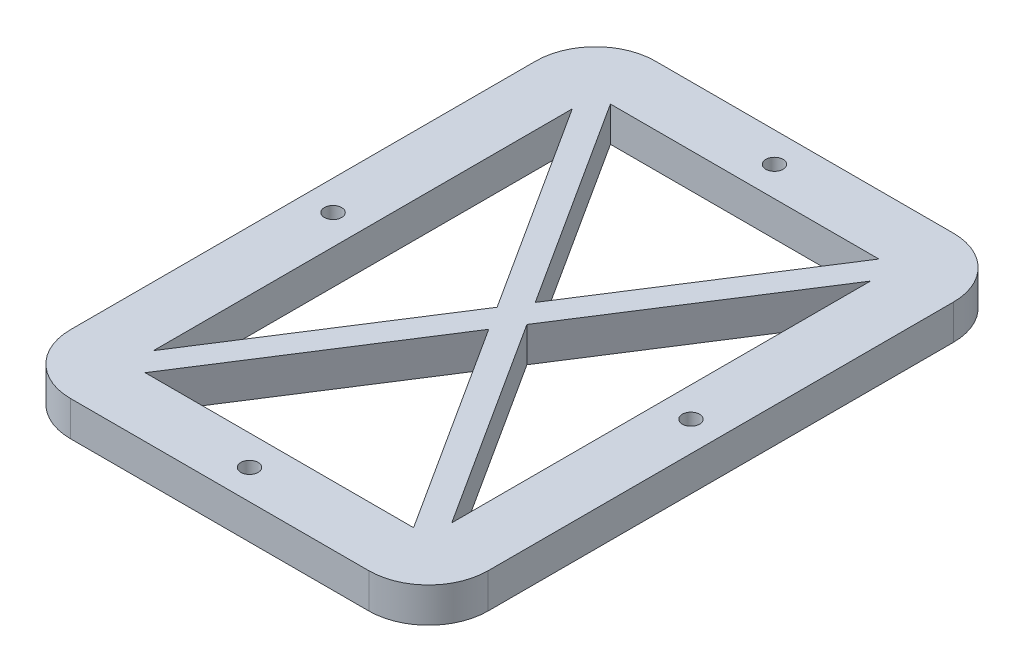
ISO-10303-21;
HEADER;
FILE_DESCRIPTION(('STEP AP214'),'2;1');
FILE_NAME('part.step','',(''),(''),'','','');
FILE_SCHEMA(('AUTOMOTIVE_DESIGN { 1 0 10303 214 1 1 1 1 }'));
ENDSEC;
DATA;
#1=APPLICATION_CONTEXT('core data for automotive mechanical design processes');
#2=APPLICATION_PROTOCOL_DEFINITION('international standard','automotive_design',2000,#1);
#3=PRODUCT_CONTEXT('',#1,'mechanical');
#4=PRODUCT('Part','Part','',(#3));
#5=PRODUCT_RELATED_PRODUCT_CATEGORY('part','',(#4));
#6=PRODUCT_DEFINITION_FORMATION('','',#4);
#7=PRODUCT_DEFINITION_CONTEXT('part definition',#1,'design');
#8=PRODUCT_DEFINITION('design','',#6,#7);
#9=PRODUCT_DEFINITION_SHAPE('','',#8);
#10=(LENGTH_UNIT() NAMED_UNIT(*) SI_UNIT(.MILLI.,.METRE.));
#11=(NAMED_UNIT(*) PLANE_ANGLE_UNIT() SI_UNIT($,.RADIAN.));
#12=(NAMED_UNIT(*) SI_UNIT($,.STERADIAN.) SOLID_ANGLE_UNIT());
#13=UNCERTAINTY_MEASURE_WITH_UNIT(LENGTH_MEASURE(1.E-05),#10,'distance_accuracy_value','');
#14=(GEOMETRIC_REPRESENTATION_CONTEXT(3) GLOBAL_UNCERTAINTY_ASSIGNED_CONTEXT((#13)) GLOBAL_UNIT_ASSIGNED_CONTEXT((#10,
#11,#12)) REPRESENTATION_CONTEXT('',''));
#15=CARTESIAN_POINT('',(0.,0.,0.));
#16=DIRECTION('',(0.,0.,1.));
#17=DIRECTION('',(1.,0.,0.));
#18=AXIS2_PLACEMENT_3D('',#15,#16,#17);
#19=CARTESIAN_POINT('',(-25.,5.85,39.));
#20=DIRECTION('',(0.,-1.,0.));
#21=DIRECTION('',(0.,0.,-1.));
#22=AXIS2_PLACEMENT_3D('',#19,#20,#21);
#23=CYLINDRICAL_SURFACE('',#22,10.);
#24=CARTESIAN_POINT('',(-25.,0.,39.));
#25=DIRECTION('',(0.,1.,0.));
#26=DIRECTION('',(0.,0.,1.));
#27=AXIS2_PLACEMENT_3D('',#24,#25,#26);
#28=CIRCLE('',#27,10.);
#29=CARTESIAN_POINT('',(-25.,0.,49.));
#30=VERTEX_POINT('',#29);
#31=CARTESIAN_POINT('',(-35.,0.,39.));
#32=VERTEX_POINT('',#31);
#33=EDGE_CURVE('E252',#30,#32,#28,.F.);
#34=ORIENTED_EDGE('',*,*,#33,.F.);
#35=DIRECTION('',(0.,-1.,0.));
#36=VECTOR('',#35,1.);
#37=CARTESIAN_POINT('',(-25.,5.85,49.));
#38=LINE('',#37,#36);
#39=CARTESIAN_POINT('',(-25.,5.85,49.));
#40=VERTEX_POINT('',#39);
#41=EDGE_CURVE('E11',#40,#30,#38,.T.);
#42=ORIENTED_EDGE('',*,*,#41,.F.);
#43=CARTESIAN_POINT('',(-25.,5.85,39.));
#44=DIRECTION('',(0.,1.,0.));
#45=DIRECTION('',(0.,0.,1.));
#46=AXIS2_PLACEMENT_3D('',#43,#44,#45);
#47=CIRCLE('',#46,10.);
#48=CARTESIAN_POINT('',(-35.,5.85,39.));
#49=VERTEX_POINT('',#48);
#50=EDGE_CURVE('E359',#40,#49,#47,.F.);
#51=ORIENTED_EDGE('',*,*,#50,.T.);
#52=DIRECTION('',(0.,-1.,0.));
#53=VECTOR('',#52,1.);
#54=CARTESIAN_POINT('',(-35.,5.85,39.));
#55=LINE('',#54,#53);
#56=EDGE_CURVE('E123',#49,#32,#55,.T.);
#57=ORIENTED_EDGE('',*,*,#56,.T.);
#58=EDGE_LOOP('',(#34,#42,#51,#57));
#59=FACE_BOUND('',#58,.T.);
#60=ADVANCED_FACE('F34',(#59),#23,.T.);
#61=CARTESIAN_POINT('',(0.,5.85,49.));
#62=DIRECTION('',(0.,0.,-1.));
#63=DIRECTION('',(-1.,0.,0.));
#64=AXIS2_PLACEMENT_3D('',#61,#62,#63);
#65=PLANE('',#64);
#66=DIRECTION('',(1.,0.,0.));
#67=VECTOR('',#66,1.);
#68=CARTESIAN_POINT('',(0.,0.,49.));
#69=LINE('',#68,#67);
#70=CARTESIAN_POINT('',(25.,0.,49.));
#71=VERTEX_POINT('',#70);
#72=EDGE_CURVE('E255',#30,#71,#69,.T.);
#73=ORIENTED_EDGE('',*,*,#72,.T.);
#74=DIRECTION('',(0.,-1.,0.));
#75=VECTOR('',#74,1.);
#76=CARTESIAN_POINT('',(25.,5.85,49.));
#77=LINE('',#76,#75);
#78=CARTESIAN_POINT('',(25.,5.85,49.));
#79=VERTEX_POINT('',#78);
#80=EDGE_CURVE('E44',#79,#71,#77,.T.);
#81=ORIENTED_EDGE('',*,*,#80,.F.);
#82=DIRECTION('',(1.,0.,0.));
#83=VECTOR('',#82,1.);
#84=CARTESIAN_POINT('',(0.,5.85,49.));
#85=LINE('',#84,#83);
#86=EDGE_CURVE('E361',#40,#79,#85,.T.);
#87=ORIENTED_EDGE('',*,*,#86,.F.);
#88=ORIENTED_EDGE('',*,*,#41,.T.);
#89=EDGE_LOOP('',(#73,#81,#87,#88));
#90=FACE_BOUND('',#89,.T.);
#91=ADVANCED_FACE('F379',(#90),#65,.F.);
#92=CARTESIAN_POINT('',(25.,5.85,39.));
#93=DIRECTION('',(0.,-1.,0.));
#94=DIRECTION('',(0.,0.,-1.));
#95=AXIS2_PLACEMENT_3D('',#92,#93,#94);
#96=CYLINDRICAL_SURFACE('',#95,10.);
#97=CARTESIAN_POINT('',(25.,0.,39.));
#98=DIRECTION('',(0.,1.,0.));
#99=DIRECTION('',(0.,0.,1.));
#100=AXIS2_PLACEMENT_3D('',#97,#98,#99);
#101=CIRCLE('',#100,10.);
#102=CARTESIAN_POINT('',(35.,0.,39.));
#103=VERTEX_POINT('',#102);
#104=EDGE_CURVE('E258',#103,#71,#101,.F.);
#105=ORIENTED_EDGE('',*,*,#104,.F.);
#106=DIRECTION('',(0.,-1.,0.));
#107=VECTOR('',#106,1.);
#108=CARTESIAN_POINT('',(35.,5.85,39.));
#109=LINE('',#108,#107);
#110=CARTESIAN_POINT('',(35.,5.85,39.));
#111=VERTEX_POINT('',#110);
#112=EDGE_CURVE('E279',#111,#103,#109,.T.);
#113=ORIENTED_EDGE('',*,*,#112,.F.);
#114=CARTESIAN_POINT('',(25.,5.85,39.));
#115=DIRECTION('',(0.,1.,0.));
#116=DIRECTION('',(0.,0.,1.));
#117=AXIS2_PLACEMENT_3D('',#114,#115,#116);
#118=CIRCLE('',#117,10.);
#119=EDGE_CURVE('E363',#111,#79,#118,.F.);
#120=ORIENTED_EDGE('',*,*,#119,.T.);
#121=ORIENTED_EDGE('',*,*,#80,.T.);
#122=EDGE_LOOP('',(#105,#113,#120,#121));
#123=FACE_BOUND('',#122,.T.);
#124=ADVANCED_FACE('F382',(#123),#96,.T.);
#125=CARTESIAN_POINT('',(35.,5.85,0.));
#126=DIRECTION('',(1.,0.,0.));
#127=DIRECTION('',(0.,0.,-1.));
#128=AXIS2_PLACEMENT_3D('',#125,#126,#127);
#129=PLANE('',#128);
#130=DIRECTION('',(0.,0.,1.));
#131=VECTOR('',#130,1.);
#132=CARTESIAN_POINT('',(35.,0.,0.));
#133=LINE('',#132,#131);
#134=CARTESIAN_POINT('',(35.,0.,-39.));
#135=VERTEX_POINT('',#134);
#136=EDGE_CURVE('E261',#135,#103,#133,.T.);
#137=ORIENTED_EDGE('',*,*,#136,.F.);
#138=DIRECTION('',(0.,-1.,0.));
#139=VECTOR('',#138,1.);
#140=CARTESIAN_POINT('',(35.,5.85,-39.));
#141=LINE('',#140,#139);
#142=CARTESIAN_POINT('',(35.,5.85,-39.));
#143=VERTEX_POINT('',#142);
#144=EDGE_CURVE('E277',#143,#135,#141,.T.);
#145=ORIENTED_EDGE('',*,*,#144,.F.);
#146=DIRECTION('',(0.,0.,1.));
#147=VECTOR('',#146,1.);
#148=CARTESIAN_POINT('',(35.,5.85,0.));
#149=LINE('',#148,#147);
#150=EDGE_CURVE('E366',#143,#111,#149,.T.);
#151=ORIENTED_EDGE('',*,*,#150,.T.);
#152=ORIENTED_EDGE('',*,*,#112,.T.);
#153=EDGE_LOOP('',(#137,#145,#151,#152));
#154=FACE_BOUND('',#153,.T.);
#155=ADVANCED_FACE('F384',(#154),#129,.T.);
#156=CARTESIAN_POINT('',(25.,5.85,-39.));
#157=DIRECTION('',(0.,-1.,0.));
#158=DIRECTION('',(0.,0.,-1.));
#159=AXIS2_PLACEMENT_3D('',#156,#157,#158);
#160=CYLINDRICAL_SURFACE('',#159,10.);
#161=CARTESIAN_POINT('',(25.,0.,-39.));
#162=DIRECTION('',(0.,1.,0.));
#163=DIRECTION('',(0.,0.,1.));
#164=AXIS2_PLACEMENT_3D('',#161,#162,#163);
#165=CIRCLE('',#164,10.);
#166=CARTESIAN_POINT('',(25.,0.,-49.));
#167=VERTEX_POINT('',#166);
#168=EDGE_CURVE('E264',#167,#135,#165,.F.);
#169=ORIENTED_EDGE('',*,*,#168,.F.);
#170=DIRECTION('',(0.,-1.,0.));
#171=VECTOR('',#170,1.);
#172=CARTESIAN_POINT('',(25.,5.85,-49.));
#173=LINE('',#172,#171);
#174=CARTESIAN_POINT('',(25.,5.85,-49.));
#175=VERTEX_POINT('',#174);
#176=EDGE_CURVE('E192',#175,#167,#173,.T.);
#177=ORIENTED_EDGE('',*,*,#176,.F.);
#178=CARTESIAN_POINT('',(25.,5.85,-39.));
#179=DIRECTION('',(0.,1.,0.));
#180=DIRECTION('',(0.,0.,1.));
#181=AXIS2_PLACEMENT_3D('',#178,#179,#180);
#182=CIRCLE('',#181,10.);
#183=EDGE_CURVE('E199',#175,#143,#182,.F.);
#184=ORIENTED_EDGE('',*,*,#183,.T.);
#185=ORIENTED_EDGE('',*,*,#144,.T.);
#186=EDGE_LOOP('',(#169,#177,#184,#185));
#187=FACE_BOUND('',#186,.T.);
#188=ADVANCED_FACE('F370',(#187),#160,.T.);
#189=CARTESIAN_POINT('',(0.,5.85,-49.));
#190=DIRECTION('',(0.,0.,-1.));
#191=DIRECTION('',(-1.,0.,0.));
#192=AXIS2_PLACEMENT_3D('',#189,#190,#191);
#193=PLANE('',#192);
#194=DIRECTION('',(1.,0.,0.));
#195=VECTOR('',#194,1.);
#196=CARTESIAN_POINT('',(0.,0.,-49.));
#197=LINE('',#196,#195);
#198=CARTESIAN_POINT('',(-25.,0.,-49.));
#199=VERTEX_POINT('',#198);
#200=EDGE_CURVE('E187',#199,#167,#197,.T.);
#201=ORIENTED_EDGE('',*,*,#200,.F.);
#202=DIRECTION('',(0.,-1.,0.));
#203=VECTOR('',#202,1.);
#204=CARTESIAN_POINT('',(-25.,5.85,-49.));
#205=LINE('',#204,#203);
#206=CARTESIAN_POINT('',(-25.,5.85,-49.));
#207=VERTEX_POINT('',#206);
#208=EDGE_CURVE('E182',#207,#199,#205,.T.);
#209=ORIENTED_EDGE('',*,*,#208,.F.);
#210=DIRECTION('',(1.,0.,0.));
#211=VECTOR('',#210,1.);
#212=CARTESIAN_POINT('',(0.,5.85,-49.));
#213=LINE('',#212,#211);
#214=EDGE_CURVE('E185',#207,#175,#213,.T.);
#215=ORIENTED_EDGE('',*,*,#214,.T.);
#216=ORIENTED_EDGE('',*,*,#176,.T.);
#217=EDGE_LOOP('',(#201,#209,#215,#216));
#218=FACE_BOUND('',#217,.T.);
#219=ADVANCED_FACE('F184',(#218),#193,.T.);
#220=CARTESIAN_POINT('',(-25.,5.85,-39.));
#221=DIRECTION('',(0.,-1.,0.));
#222=DIRECTION('',(0.,0.,-1.));
#223=AXIS2_PLACEMENT_3D('',#220,#221,#222);
#224=CYLINDRICAL_SURFACE('',#223,10.);
#225=CARTESIAN_POINT('',(-25.,0.,-39.));
#226=DIRECTION('',(0.,1.,0.));
#227=DIRECTION('',(0.,0.,1.));
#228=AXIS2_PLACEMENT_3D('',#225,#226,#227);
#229=CIRCLE('',#228,10.);
#230=CARTESIAN_POINT('',(-35.,0.,-39.));
#231=VERTEX_POINT('',#230);
#232=EDGE_CURVE('E268',#231,#199,#229,.F.);
#233=ORIENTED_EDGE('',*,*,#232,.F.);
#234=DIRECTION('',(0.,-1.,0.));
#235=VECTOR('',#234,1.);
#236=CARTESIAN_POINT('',(-35.,5.85,-39.));
#237=LINE('',#236,#235);
#238=CARTESIAN_POINT('',(-35.,5.85,-39.));
#239=VERTEX_POINT('',#238);
#240=EDGE_CURVE('E116',#239,#231,#237,.T.);
#241=ORIENTED_EDGE('',*,*,#240,.F.);
#242=CARTESIAN_POINT('',(-25.,5.85,-39.));
#243=DIRECTION('',(0.,1.,0.));
#244=DIRECTION('',(0.,0.,1.));
#245=AXIS2_PLACEMENT_3D('',#242,#243,#244);
#246=CIRCLE('',#245,10.);
#247=EDGE_CURVE('E196',#239,#207,#246,.F.);
#248=ORIENTED_EDGE('',*,*,#247,.T.);
#249=ORIENTED_EDGE('',*,*,#208,.T.);
#250=EDGE_LOOP('',(#233,#241,#248,#249));
#251=FACE_BOUND('',#250,.T.);
#252=ADVANCED_FACE('F201',(#251),#224,.T.);
#253=CARTESIAN_POINT('',(1.77190121155639,5.85,1.13583410997205));
#254=DIRECTION('',(-0.841879138963874,0.,-0.539666114720432));
#255=DIRECTION('',(-0.539666114720432,0.,0.841879138963874));
#256=AXIS2_PLACEMENT_3D('',#253,#254,#255);
#257=PLANE('',#256);
#258=DIRECTION('',(0.539666114720432,0.,-0.841879138963874));
#259=VECTOR('',#258,1.);
#260=CARTESIAN_POINT('',(1.77190121155639,0.,1.13583410997205));
#261=LINE('',#260,#259);
#262=CARTESIAN_POINT('',(-22.5,0.,39.));
#263=VERTEX_POINT('',#262);
#264=CARTESIAN_POINT('',(0.,0.,3.90000000000001));
#265=VERTEX_POINT('',#264);
#266=EDGE_CURVE('E232',#263,#265,#261,.T.);
#267=ORIENTED_EDGE('',*,*,#266,.T.);
#268=DIRECTION('',(0.,-1.,0.));
#269=VECTOR('',#268,1.);
#270=CARTESIAN_POINT('',(0.,5.85,3.90000000000001));
#271=LINE('',#270,#269);
#272=CARTESIAN_POINT('',(0.,5.85,3.90000000000001));
#273=VERTEX_POINT('',#272);
#274=EDGE_CURVE('E274',#273,#265,#271,.T.);
#275=ORIENTED_EDGE('',*,*,#274,.F.);
#276=DIRECTION('',(0.539666114720432,0.,-0.841879138963874));
#277=VECTOR('',#276,1.);
#278=CARTESIAN_POINT('',(1.77190121155639,5.85,1.13583410997205));
#279=LINE('',#278,#277);
#280=CARTESIAN_POINT('',(-22.5,5.85,39.));
#281=VERTEX_POINT('',#280);
#282=EDGE_CURVE('E340',#281,#273,#279,.T.);
#283=ORIENTED_EDGE('',*,*,#282,.F.);
#284=DIRECTION('',(0.,-1.,0.));
#285=VECTOR('',#284,1.);
#286=CARTESIAN_POINT('',(-22.5,5.85,39.));
#287=LINE('',#286,#285);
#288=EDGE_CURVE('E282',#281,#263,#287,.T.);
#289=ORIENTED_EDGE('',*,*,#288,.T.);
#290=EDGE_LOOP('',(#267,#275,#283,#289));
#291=FACE_BOUND('',#290,.T.);
#292=ADVANCED_FACE('F425',(#291),#257,.F.);
#293=CARTESIAN_POINT('',(-1.77190121155639,5.85,1.13583410997204));
#294=DIRECTION('',(-0.841879138963874,0.,0.539666114720432));
#295=DIRECTION('',(0.539666114720432,0.,0.841879138963874));
#296=AXIS2_PLACEMENT_3D('',#293,#294,#295);
#297=PLANE('',#296);
#298=DIRECTION('',(-0.539666114720432,0.,-0.841879138963874));
#299=VECTOR('',#298,1.);
#300=CARTESIAN_POINT('',(-1.77190121155639,0.,1.13583410997204));
#301=LINE('',#300,#299);
#302=CARTESIAN_POINT('',(22.5,0.,39.));
#303=VERTEX_POINT('',#302);
#304=EDGE_CURVE('E235',#303,#265,#301,.T.);
#305=ORIENTED_EDGE('',*,*,#304,.F.);
#306=DIRECTION('',(0.,-1.,0.));
#307=VECTOR('',#306,1.);
#308=CARTESIAN_POINT('',(22.5,5.85,39.));
#309=LINE('',#308,#307);
#310=CARTESIAN_POINT('',(22.5,5.85,39.));
#311=VERTEX_POINT('',#310);
#312=EDGE_CURVE('E285',#311,#303,#309,.T.);
#313=ORIENTED_EDGE('',*,*,#312,.F.);
#314=DIRECTION('',(-0.539666114720432,0.,-0.841879138963874));
#315=VECTOR('',#314,1.);
#316=CARTESIAN_POINT('',(-1.77190121155639,5.85,1.13583410997204));
#317=LINE('',#316,#315);
#318=EDGE_CURVE('E342',#311,#273,#317,.T.);
#319=ORIENTED_EDGE('',*,*,#318,.T.);
#320=ORIENTED_EDGE('',*,*,#274,.T.);
#321=EDGE_LOOP('',(#305,#313,#319,#320));
#322=FACE_BOUND('',#321,.T.);
#323=ADVANCED_FACE('F421',(#322),#297,.T.);
#324=CARTESIAN_POINT('',(1.77190121155639,5.85,1.13583410997205));
#325=DIRECTION('',(-0.841879138963874,0.,-0.539666114720432));
#326=DIRECTION('',(-0.539666114720432,0.,0.841879138963874));
#327=AXIS2_PLACEMENT_3D('',#324,#325,#326);
#328=PLANE('',#327);
#329=DIRECTION('',(0.539666114720432,0.,-0.841879138963874));
#330=VECTOR('',#329,1.);
#331=CARTESIAN_POINT('',(1.77190121155639,0.,1.13583410997205));
#332=LINE('',#331,#330);
#333=CARTESIAN_POINT('',(2.50000000000001,0.,0.));
#334=VERTEX_POINT('',#333);
#335=CARTESIAN_POINT('',(25.,0.,-35.1));
#336=VERTEX_POINT('',#335);
#337=EDGE_CURVE('E225',#334,#336,#332,.T.);
#338=ORIENTED_EDGE('',*,*,#337,.T.);
#339=DIRECTION('',(0.,-1.,0.));
#340=VECTOR('',#339,1.);
#341=CARTESIAN_POINT('',(25.,5.85,-35.1));
#342=LINE('',#341,#340);
#343=CARTESIAN_POINT('',(25.,5.85,-35.1));
#344=VERTEX_POINT('',#343);
#345=EDGE_CURVE('E286',#344,#336,#342,.T.);
#346=ORIENTED_EDGE('',*,*,#345,.F.);
#347=DIRECTION('',(0.539666114720432,0.,-0.841879138963874));
#348=VECTOR('',#347,1.);
#349=CARTESIAN_POINT('',(1.77190121155639,5.85,1.13583410997205));
#350=LINE('',#349,#348);
#351=CARTESIAN_POINT('',(2.50000000000001,5.85,0.));
#352=VERTEX_POINT('',#351);
#353=EDGE_CURVE('E333',#352,#344,#350,.T.);
#354=ORIENTED_EDGE('',*,*,#353,.F.);
#355=DIRECTION('',(0.,-1.,0.));
#356=VECTOR('',#355,1.);
#357=CARTESIAN_POINT('',(2.50000000000001,5.85,0.));
#358=LINE('',#357,#356);
#359=EDGE_CURVE('E289',#352,#334,#358,.T.);
#360=ORIENTED_EDGE('',*,*,#359,.T.);
#361=EDGE_LOOP('',(#338,#346,#354,#360));
#362=FACE_BOUND('',#361,.T.);
#363=ADVANCED_FACE('F424',(#362),#328,.F.);
#364=CARTESIAN_POINT('',(25.,5.85,0.));
#365=DIRECTION('',(1.,0.,0.));
#366=DIRECTION('',(0.,0.,-1.));
#367=AXIS2_PLACEMENT_3D('',#364,#365,#366);
#368=PLANE('',#367);
#369=DIRECTION('',(0.,0.,1.));
#370=VECTOR('',#369,1.);
#371=CARTESIAN_POINT('',(25.,0.,0.));
#372=LINE('',#371,#370);
#373=CARTESIAN_POINT('',(25.,0.,35.1));
#374=VERTEX_POINT('',#373);
#375=EDGE_CURVE('E228',#336,#374,#372,.T.);
#376=ORIENTED_EDGE('',*,*,#375,.T.);
#377=DIRECTION('',(0.,-1.,0.));
#378=VECTOR('',#377,1.);
#379=CARTESIAN_POINT('',(25.,5.85,35.1));
#380=LINE('',#379,#378);
#381=CARTESIAN_POINT('',(25.,5.85,35.1));
#382=VERTEX_POINT('',#381);
#383=EDGE_CURVE('E292',#382,#374,#380,.T.);
#384=ORIENTED_EDGE('',*,*,#383,.F.);
#385=DIRECTION('',(0.,0.,1.));
#386=VECTOR('',#385,1.);
#387=CARTESIAN_POINT('',(25.,5.85,0.));
#388=LINE('',#387,#386);
#389=EDGE_CURVE('E336',#344,#382,#388,.T.);
#390=ORIENTED_EDGE('',*,*,#389,.F.);
#391=ORIENTED_EDGE('',*,*,#345,.T.);
#392=EDGE_LOOP('',(#376,#384,#390,#391));
#393=FACE_BOUND('',#392,.T.);
#394=ADVANCED_FACE('F434',(#393),#368,.F.);
#395=CARTESIAN_POINT('',(-1.77190121155639,5.85,1.13583410997204));
#396=DIRECTION('',(-0.841879138963874,0.,0.539666114720432));
#397=DIRECTION('',(0.539666114720432,0.,0.841879138963874));
#398=AXIS2_PLACEMENT_3D('',#395,#396,#397);
#399=PLANE('',#398);
#400=DIRECTION('',(-0.539666114720432,0.,-0.841879138963874));
#401=VECTOR('',#400,1.);
#402=CARTESIAN_POINT('',(-1.77190121155639,0.,1.13583410997204));
#403=LINE('',#402,#401);
#404=CARTESIAN_POINT('',(-2.5,0.,0.));
#405=VERTEX_POINT('',#404);
#406=CARTESIAN_POINT('',(-25.,0.,-35.1));
#407=VERTEX_POINT('',#406);
#408=EDGE_CURVE('E216',#405,#407,#403,.T.);
#409=ORIENTED_EDGE('',*,*,#408,.F.);
#410=DIRECTION('',(0.,-1.,0.));
#411=VECTOR('',#410,1.);
#412=CARTESIAN_POINT('',(-2.5,5.85,0.));
#413=LINE('',#412,#411);
#414=CARTESIAN_POINT('',(-2.5,5.85,0.));
#415=VERTEX_POINT('',#414);
#416=EDGE_CURVE('E293',#415,#405,#413,.T.);
#417=ORIENTED_EDGE('',*,*,#416,.F.);
#418=DIRECTION('',(-0.539666114720432,0.,-0.841879138963874));
#419=VECTOR('',#418,1.);
#420=CARTESIAN_POINT('',(-1.77190121155639,5.85,1.13583410997204));
#421=LINE('',#420,#419);
#422=CARTESIAN_POINT('',(-25.,5.85,-35.1));
#423=VERTEX_POINT('',#422);
#424=EDGE_CURVE('E320',#415,#423,#421,.T.);
#425=ORIENTED_EDGE('',*,*,#424,.T.);
#426=DIRECTION('',(0.,-1.,0.));
#427=VECTOR('',#426,1.);
#428=CARTESIAN_POINT('',(-25.,5.85,-35.1));
#429=LINE('',#428,#427);
#430=EDGE_CURVE('E298',#423,#407,#429,.T.);
#431=ORIENTED_EDGE('',*,*,#430,.T.);
#432=EDGE_LOOP('',(#409,#417,#425,#431));
#433=FACE_BOUND('',#432,.T.);
#434=ADVANCED_FACE('F437',(#433),#399,.T.);
#435=CARTESIAN_POINT('',(-1.77190121155638,5.85,-1.13583410997204));
#436=DIRECTION('',(-0.841879138963874,0.,-0.539666114720432));
#437=DIRECTION('',(-0.539666114720432,0.,0.841879138963874));
#438=AXIS2_PLACEMENT_3D('',#435,#436,#437);
#439=PLANE('',#438);
#440=DIRECTION('',(0.539666114720432,0.,-0.841879138963874));
#441=VECTOR('',#440,1.);
#442=CARTESIAN_POINT('',(-1.77190121155638,0.,-1.13583410997204));
#443=LINE('',#442,#441);
#444=CARTESIAN_POINT('',(-25.,0.,35.1));
#445=VERTEX_POINT('',#444);
#446=EDGE_CURVE('E219',#445,#405,#443,.T.);
#447=ORIENTED_EDGE('',*,*,#446,.F.);
#448=DIRECTION('',(0.,-1.,0.));
#449=VECTOR('',#448,1.);
#450=CARTESIAN_POINT('',(-25.,5.85,35.1));
#451=LINE('',#450,#449);
#452=CARTESIAN_POINT('',(-25.,5.85,35.1));
#453=VERTEX_POINT('',#452);
#454=EDGE_CURVE('E300',#453,#445,#451,.T.);
#455=ORIENTED_EDGE('',*,*,#454,.F.);
#456=DIRECTION('',(0.539666114720432,0.,-0.841879138963874));
#457=VECTOR('',#456,1.);
#458=CARTESIAN_POINT('',(-1.77190121155638,5.85,-1.13583410997204));
#459=LINE('',#458,#457);
#460=EDGE_CURVE('E323',#453,#415,#459,.T.);
#461=ORIENTED_EDGE('',*,*,#460,.T.);
#462=ORIENTED_EDGE('',*,*,#416,.T.);
#463=EDGE_LOOP('',(#447,#455,#461,#462));
#464=FACE_BOUND('',#463,.T.);
#465=ADVANCED_FACE('F445',(#464),#439,.T.);
#466=CARTESIAN_POINT('',(-1.77190121155638,5.85,-1.13583410997204));
#467=DIRECTION('',(-0.841879138963874,0.,-0.539666114720432));
#468=DIRECTION('',(-0.539666114720432,0.,0.841879138963874));
#469=AXIS2_PLACEMENT_3D('',#466,#467,#468);
#470=PLANE('',#469);
#471=DIRECTION('',(0.539666114720432,0.,-0.841879138963874));
#472=VECTOR('',#471,1.);
#473=CARTESIAN_POINT('',(-1.77190121155638,0.,-1.13583410997204));
#474=LINE('',#473,#472);
#475=CARTESIAN_POINT('',(0.,0.,-3.9));
#476=VERTEX_POINT('',#475);
#477=CARTESIAN_POINT('',(22.5,0.,-39.));
#478=VERTEX_POINT('',#477);
#479=EDGE_CURVE('E207',#476,#478,#474,.T.);
#480=ORIENTED_EDGE('',*,*,#479,.F.);
#481=DIRECTION('',(0.,-1.,0.));
#482=VECTOR('',#481,1.);
#483=CARTESIAN_POINT('',(0.,5.85,-3.9));
#484=LINE('',#483,#482);
#485=CARTESIAN_POINT('',(0.,5.85,-3.9));
#486=VERTEX_POINT('',#485);
#487=EDGE_CURVE('E38',#486,#476,#484,.T.);
#488=ORIENTED_EDGE('',*,*,#487,.F.);
#489=DIRECTION('',(0.539666114720432,0.,-0.841879138963874));
#490=VECTOR('',#489,1.);
#491=CARTESIAN_POINT('',(-1.77190121155638,5.85,-1.13583410997204));
#492=LINE('',#491,#490);
#493=CARTESIAN_POINT('',(22.5,5.85,-39.));
#494=VERTEX_POINT('',#493);
#495=EDGE_CURVE('E272',#486,#494,#492,.T.);
#496=ORIENTED_EDGE('',*,*,#495,.T.);
#497=DIRECTION('',(0.,-1.,0.));
#498=VECTOR('',#497,1.);
#499=CARTESIAN_POINT('',(22.5,5.85,-39.));
#500=LINE('',#499,#498);
#501=EDGE_CURVE('E203',#494,#478,#500,.T.);
#502=ORIENTED_EDGE('',*,*,#501,.T.);
#503=EDGE_LOOP('',(#480,#488,#496,#502));
#504=FACE_BOUND('',#503,.T.);
#505=ADVANCED_FACE('F36',(#504),#470,.T.);
#506=CARTESIAN_POINT('',(1.77190121155639,5.85,-1.13583410997204));
#507=DIRECTION('',(-0.841879138963874,0.,0.539666114720432));
#508=DIRECTION('',(0.539666114720432,0.,0.841879138963874));
#509=AXIS2_PLACEMENT_3D('',#506,#507,#508);
#510=PLANE('',#509);
#511=DIRECTION('',(-0.539666114720432,0.,-0.841879138963874));
#512=VECTOR('',#511,1.);
#513=CARTESIAN_POINT('',(1.77190121155639,0.,-1.13583410997204));
#514=LINE('',#513,#512);
#515=CARTESIAN_POINT('',(-22.5,0.,-39.));
#516=VERTEX_POINT('',#515);
#517=EDGE_CURVE('E210',#476,#516,#514,.T.);
#518=ORIENTED_EDGE('',*,*,#517,.T.);
#519=DIRECTION('',(0.,-1.,0.));
#520=VECTOR('',#519,1.);
#521=CARTESIAN_POINT('',(-22.5,5.85,-39.));
#522=LINE('',#521,#520);
#523=CARTESIAN_POINT('',(-22.5,5.85,-39.));
#524=VERTEX_POINT('',#523);
#525=EDGE_CURVE('E303',#524,#516,#522,.T.);
#526=ORIENTED_EDGE('',*,*,#525,.F.);
#527=DIRECTION('',(-0.539666114720432,0.,-0.841879138963874));
#528=VECTOR('',#527,1.);
#529=CARTESIAN_POINT('',(1.77190121155639,5.85,-1.13583410997204));
#530=LINE('',#529,#528);
#531=EDGE_CURVE('E311',#486,#524,#530,.T.);
#532=ORIENTED_EDGE('',*,*,#531,.F.);
#533=ORIENTED_EDGE('',*,*,#487,.T.);
#534=EDGE_LOOP('',(#518,#526,#532,#533));
#535=FACE_BOUND('',#534,.T.);
#536=ADVANCED_FACE('F310',(#535),#510,.F.);
#537=CARTESIAN_POINT('',(0.,5.85,-44.));
#538=DIRECTION('',(0.,-1.,0.));
#539=DIRECTION('',(0.,0.,-1.));
#540=AXIS2_PLACEMENT_3D('',#537,#538,#539);
#541=CYLINDRICAL_SURFACE('',#540,1.45);
#542=CARTESIAN_POINT('',(0.,5.85,-44.));
#543=DIRECTION('',(0.,1.,0.));
#544=DIRECTION('',(0.,0.,1.));
#545=AXIS2_PLACEMENT_3D('',#542,#543,#544);
#546=CIRCLE('',#545,1.45);
#547=CARTESIAN_POINT('',(0.,5.85,-42.55));
#548=VERTEX_POINT('',#547);
#549=EDGE_CURVE('E356',#548,#548,#546,.T.);
#550=ORIENTED_EDGE('',*,*,#549,.T.);
#551=EDGE_LOOP('',(#550));
#552=FACE_BOUND('',#551,.T.);
#553=CARTESIAN_POINT('',(0.,0.,-44.));
#554=DIRECTION('',(0.,1.,0.));
#555=DIRECTION('',(0.,0.,1.));
#556=AXIS2_PLACEMENT_3D('',#553,#554,#555);
#557=CIRCLE('',#556,1.45);
#558=CARTESIAN_POINT('',(0.,0.,-42.55));
#559=VERTEX_POINT('',#558);
#560=EDGE_CURVE('E249',#559,#559,#557,.T.);
#561=ORIENTED_EDGE('',*,*,#560,.F.);
#562=EDGE_LOOP('',(#561));
#563=FACE_BOUND('',#562,.T.);
#564=ADVANCED_FACE('F400',(#552,#563),#541,.F.);
#565=CARTESIAN_POINT('',(0.,5.85,44.));
#566=DIRECTION('',(0.,-1.,0.));
#567=DIRECTION('',(0.,0.,-1.));
#568=AXIS2_PLACEMENT_3D('',#565,#566,#567);
#569=CYLINDRICAL_SURFACE('',#568,1.45);
#570=CARTESIAN_POINT('',(0.,5.85,44.));
#571=DIRECTION('',(0.,1.,0.));
#572=DIRECTION('',(0.,0.,1.));
#573=AXIS2_PLACEMENT_3D('',#570,#571,#572);
#574=CIRCLE('',#573,1.45);
#575=CARTESIAN_POINT('',(0.,5.85,45.45));
#576=VERTEX_POINT('',#575);
#577=EDGE_CURVE('E353',#576,#576,#574,.T.);
#578=ORIENTED_EDGE('',*,*,#577,.T.);
#579=EDGE_LOOP('',(#578));
#580=FACE_BOUND('',#579,.T.);
#581=CARTESIAN_POINT('',(0.,0.,44.));
#582=DIRECTION('',(0.,1.,0.));
#583=DIRECTION('',(0.,0.,1.));
#584=AXIS2_PLACEMENT_3D('',#581,#582,#583);
#585=CIRCLE('',#584,1.45);
#586=CARTESIAN_POINT('',(0.,0.,45.45));
#587=VERTEX_POINT('',#586);
#588=EDGE_CURVE('E246',#587,#587,#585,.T.);
#589=ORIENTED_EDGE('',*,*,#588,.F.);
#590=EDGE_LOOP('',(#589));
#591=FACE_BOUND('',#590,.T.);
#592=ADVANCED_FACE('F403',(#580,#591),#569,.F.);
#593=CARTESIAN_POINT('',(-30.,5.85,0.));
#594=DIRECTION('',(0.,-1.,0.));
#595=DIRECTION('',(0.,0.,-1.));
#596=AXIS2_PLACEMENT_3D('',#593,#594,#595);
#597=CYLINDRICAL_SURFACE('',#596,1.45);
#598=CARTESIAN_POINT('',(-30.,5.85,0.));
#599=DIRECTION('',(0.,1.,0.));
#600=DIRECTION('',(0.,0.,1.));
#601=AXIS2_PLACEMENT_3D('',#598,#599,#600);
#602=CIRCLE('',#601,1.45);
#603=CARTESIAN_POINT('',(-30.,5.85,1.45));
#604=VERTEX_POINT('',#603);
#605=EDGE_CURVE('E350',#604,#604,#602,.T.);
#606=ORIENTED_EDGE('',*,*,#605,.T.);
#607=EDGE_LOOP('',(#606));
#608=FACE_BOUND('',#607,.T.);
#609=CARTESIAN_POINT('',(-30.,0.,0.));
#610=DIRECTION('',(0.,1.,0.));
#611=DIRECTION('',(0.,0.,1.));
#612=AXIS2_PLACEMENT_3D('',#609,#610,#611);
#613=CIRCLE('',#612,1.45);
#614=CARTESIAN_POINT('',(-30.,0.,1.45));
#615=VERTEX_POINT('',#614);
#616=EDGE_CURVE('E243',#615,#615,#613,.T.);
#617=ORIENTED_EDGE('',*,*,#616,.F.);
#618=EDGE_LOOP('',(#617));
#619=FACE_BOUND('',#618,.T.);
#620=ADVANCED_FACE('F407',(#608,#619),#597,.F.);
#621=CARTESIAN_POINT('',(30.,5.85,0.));
#622=DIRECTION('',(0.,-1.,0.));
#623=DIRECTION('',(0.,0.,-1.));
#624=AXIS2_PLACEMENT_3D('',#621,#622,#623);
#625=CYLINDRICAL_SURFACE('',#624,1.45);
#626=CARTESIAN_POINT('',(30.,5.85,0.));
#627=DIRECTION('',(0.,1.,0.));
#628=DIRECTION('',(0.,0.,1.));
#629=AXIS2_PLACEMENT_3D('',#626,#627,#628);
#630=CIRCLE('',#629,1.45);
#631=CARTESIAN_POINT('',(30.,5.85,1.45));
#632=VERTEX_POINT('',#631);
#633=EDGE_CURVE('E347',#632,#632,#630,.T.);
#634=ORIENTED_EDGE('',*,*,#633,.T.);
#635=EDGE_LOOP('',(#634));
#636=FACE_BOUND('',#635,.T.);
#637=CARTESIAN_POINT('',(30.,0.,0.));
#638=DIRECTION('',(0.,1.,0.));
#639=DIRECTION('',(0.,0.,1.));
#640=AXIS2_PLACEMENT_3D('',#637,#638,#639);
#641=CIRCLE('',#640,1.45);
#642=CARTESIAN_POINT('',(30.,0.,1.45));
#643=VERTEX_POINT('',#642);
#644=EDGE_CURVE('E240',#643,#643,#641,.T.);
#645=ORIENTED_EDGE('',*,*,#644,.F.);
#646=EDGE_LOOP('',(#645));
#647=FACE_BOUND('',#646,.T.);
#648=ADVANCED_FACE('F411',(#636,#647),#625,.F.);
#649=CARTESIAN_POINT('',(0.,5.85,39.));
#650=DIRECTION('',(0.,0.,1.));
#651=DIRECTION('',(1.,0.,0.));
#652=AXIS2_PLACEMENT_3D('',#649,#650,#651);
#653=PLANE('',#652);
#654=DIRECTION('',(-1.,0.,0.));
#655=VECTOR('',#654,1.);
#656=CARTESIAN_POINT('',(0.,0.,39.));
#657=LINE('',#656,#655);
#658=EDGE_CURVE('E238',#303,#263,#657,.T.);
#659=ORIENTED_EDGE('',*,*,#658,.T.);
#660=ORIENTED_EDGE('',*,*,#288,.F.);
#661=DIRECTION('',(-1.,0.,0.));
#662=VECTOR('',#661,1.);
#663=CARTESIAN_POINT('',(0.,5.85,39.));
#664=LINE('',#663,#662);
#665=EDGE_CURVE('E345',#311,#281,#664,.T.);
#666=ORIENTED_EDGE('',*,*,#665,.F.);
#667=ORIENTED_EDGE('',*,*,#312,.T.);
#668=EDGE_LOOP('',(#659,#660,#666,#667));
#669=FACE_BOUND('',#668,.T.);
#670=ADVANCED_FACE('F415',(#669),#653,.F.);
#671=CARTESIAN_POINT('',(1.77190121155639,5.85,-1.13583410997204));
#672=DIRECTION('',(-0.841879138963874,0.,0.539666114720432));
#673=DIRECTION('',(0.539666114720432,0.,0.841879138963874));
#674=AXIS2_PLACEMENT_3D('',#671,#672,#673);
#675=PLANE('',#674);
#676=DIRECTION('',(-0.539666114720432,0.,-0.841879138963874));
#677=VECTOR('',#676,1.);
#678=CARTESIAN_POINT('',(1.77190121155639,0.,-1.13583410997204));
#679=LINE('',#678,#677);
#680=EDGE_CURVE('E230',#374,#334,#679,.T.);
#681=ORIENTED_EDGE('',*,*,#680,.T.);
#682=ORIENTED_EDGE('',*,*,#359,.F.);
#683=DIRECTION('',(-0.539666114720432,0.,-0.841879138963874));
#684=VECTOR('',#683,1.);
#685=CARTESIAN_POINT('',(1.77190121155639,5.85,-1.13583410997204));
#686=LINE('',#685,#684);
#687=EDGE_CURVE('E338',#382,#352,#686,.T.);
#688=ORIENTED_EDGE('',*,*,#687,.F.);
#689=ORIENTED_EDGE('',*,*,#383,.T.);
#690=EDGE_LOOP('',(#681,#682,#688,#689));
#691=FACE_BOUND('',#690,.T.);
#692=ADVANCED_FACE('F419',(#691),#675,.F.);
#693=CARTESIAN_POINT('',(-25.,5.85,0.));
#694=DIRECTION('',(1.,0.,0.));
#695=DIRECTION('',(0.,0.,-1.));
#696=AXIS2_PLACEMENT_3D('',#693,#694,#695);
#697=PLANE('',#696);
#698=DIRECTION('',(0.,0.,1.));
#699=VECTOR('',#698,1.);
#700=CARTESIAN_POINT('',(-25.,0.,0.));
#701=LINE('',#700,#699);
#702=EDGE_CURVE('E222',#407,#445,#701,.T.);
#703=ORIENTED_EDGE('',*,*,#702,.F.);
#704=ORIENTED_EDGE('',*,*,#430,.F.);
#705=DIRECTION('',(0.,0.,1.));
#706=VECTOR('',#705,1.);
#707=CARTESIAN_POINT('',(-25.,5.85,0.));
#708=LINE('',#707,#706);
#709=EDGE_CURVE('E330',#423,#453,#708,.T.);
#710=ORIENTED_EDGE('',*,*,#709,.T.);
#711=ORIENTED_EDGE('',*,*,#454,.T.);
#712=EDGE_LOOP('',(#703,#704,#710,#711));
#713=FACE_BOUND('',#712,.T.);
#714=ADVANCED_FACE('F432',(#713),#697,.T.);
#715=CARTESIAN_POINT('',(0.,5.85,-39.));
#716=DIRECTION('',(0.,0.,1.));
#717=DIRECTION('',(1.,0.,0.));
#718=AXIS2_PLACEMENT_3D('',#715,#716,#717);
#719=PLANE('',#718);
#720=DIRECTION('',(-1.,0.,0.));
#721=VECTOR('',#720,1.);
#722=CARTESIAN_POINT('',(0.,0.,-39.));
#723=LINE('',#722,#721);
#724=EDGE_CURVE('E213',#478,#516,#723,.T.);
#725=ORIENTED_EDGE('',*,*,#724,.F.);
#726=ORIENTED_EDGE('',*,*,#501,.F.);
#727=DIRECTION('',(-1.,0.,0.));
#728=VECTOR('',#727,1.);
#729=CARTESIAN_POINT('',(0.,5.85,-39.));
#730=LINE('',#729,#728);
#731=EDGE_CURVE('E318',#494,#524,#730,.T.);
#732=ORIENTED_EDGE('',*,*,#731,.T.);
#733=ORIENTED_EDGE('',*,*,#525,.T.);
#734=EDGE_LOOP('',(#725,#726,#732,#733));
#735=FACE_BOUND('',#734,.T.);
#736=ADVANCED_FACE('F317',(#735),#719,.T.);
#737=CARTESIAN_POINT('',(-35.,5.85,0.));
#738=DIRECTION('',(1.,0.,0.));
#739=DIRECTION('',(0.,0.,-1.));
#740=AXIS2_PLACEMENT_3D('',#737,#738,#739);
#741=PLANE('',#740);
#742=DIRECTION('',(0.,0.,1.));
#743=VECTOR('',#742,1.);
#744=CARTESIAN_POINT('',(-35.,0.,0.));
#745=LINE('',#744,#743);
#746=EDGE_CURVE('E270',#231,#32,#745,.T.);
#747=ORIENTED_EDGE('',*,*,#746,.T.);
#748=ORIENTED_EDGE('',*,*,#56,.F.);
#749=DIRECTION('',(0.,0.,1.));
#750=VECTOR('',#749,1.);
#751=CARTESIAN_POINT('',(-35.,5.85,0.));
#752=LINE('',#751,#750);
#753=EDGE_CURVE('E53',#239,#49,#752,.T.);
#754=ORIENTED_EDGE('',*,*,#753,.F.);
#755=ORIENTED_EDGE('',*,*,#240,.T.);
#756=EDGE_LOOP('',(#747,#748,#754,#755));
#757=FACE_BOUND('',#756,.T.);
#758=ADVANCED_FACE('F374',(#757),#741,.F.);
#759=CARTESIAN_POINT('',(0.,5.85,0.));
#760=DIRECTION('',(0.,1.,0.));
#761=DIRECTION('',(0.,0.,1.));
#762=AXIS2_PLACEMENT_3D('',#759,#760,#761);
#763=PLANE('',#762);
#764=ORIENTED_EDGE('',*,*,#495,.F.);
#765=ORIENTED_EDGE('',*,*,#531,.T.);
#766=ORIENTED_EDGE('',*,*,#731,.F.);
#767=EDGE_LOOP('',(#764,#765,#766));
#768=FACE_BOUND('',#767,.T.);
#769=ORIENTED_EDGE('',*,*,#424,.F.);
#770=ORIENTED_EDGE('',*,*,#460,.F.);
#771=ORIENTED_EDGE('',*,*,#709,.F.);
#772=EDGE_LOOP('',(#769,#770,#771));
#773=FACE_BOUND('',#772,.T.);
#774=ORIENTED_EDGE('',*,*,#353,.T.);
#775=ORIENTED_EDGE('',*,*,#389,.T.);
#776=ORIENTED_EDGE('',*,*,#687,.T.);
#777=EDGE_LOOP('',(#774,#775,#776));
#778=FACE_BOUND('',#777,.T.);
#779=ORIENTED_EDGE('',*,*,#282,.T.);
#780=ORIENTED_EDGE('',*,*,#318,.F.);
#781=ORIENTED_EDGE('',*,*,#665,.T.);
#782=EDGE_LOOP('',(#779,#780,#781));
#783=FACE_BOUND('',#782,.T.);
#784=ORIENTED_EDGE('',*,*,#633,.F.);
#785=EDGE_LOOP('',(#784));
#786=FACE_BOUND('',#785,.T.);
#787=ORIENTED_EDGE('',*,*,#605,.F.);
#788=EDGE_LOOP('',(#787));
#789=FACE_BOUND('',#788,.T.);
#790=ORIENTED_EDGE('',*,*,#577,.F.);
#791=EDGE_LOOP('',(#790));
#792=FACE_BOUND('',#791,.T.);
#793=ORIENTED_EDGE('',*,*,#549,.F.);
#794=EDGE_LOOP('',(#793));
#795=FACE_BOUND('',#794,.T.);
#796=ORIENTED_EDGE('',*,*,#50,.F.);
#797=ORIENTED_EDGE('',*,*,#86,.T.);
#798=ORIENTED_EDGE('',*,*,#119,.F.);
#799=ORIENTED_EDGE('',*,*,#150,.F.);
#800=ORIENTED_EDGE('',*,*,#183,.F.);
#801=ORIENTED_EDGE('',*,*,#214,.F.);
#802=ORIENTED_EDGE('',*,*,#247,.F.);
#803=ORIENTED_EDGE('',*,*,#753,.T.);
#804=EDGE_LOOP('',(#796,#797,#798,#799,#800,#801,#802,#803));
#805=FACE_BOUND('',#804,.T.);
#806=ADVANCED_FACE('F195',(#768,#773,#778,#783,#786,#789,#792,#795,#805),#763,.T.);
#807=CARTESIAN_POINT('',(0.,0.,0.));
#808=DIRECTION('',(0.,1.,0.));
#809=DIRECTION('',(0.,0.,1.));
#810=AXIS2_PLACEMENT_3D('',#807,#808,#809);
#811=PLANE('',#810);
#812=ORIENTED_EDGE('',*,*,#479,.T.);
#813=ORIENTED_EDGE('',*,*,#724,.T.);
#814=ORIENTED_EDGE('',*,*,#517,.F.);
#815=EDGE_LOOP('',(#812,#813,#814));
#816=FACE_BOUND('',#815,.T.);
#817=ORIENTED_EDGE('',*,*,#408,.T.);
#818=ORIENTED_EDGE('',*,*,#702,.T.);
#819=ORIENTED_EDGE('',*,*,#446,.T.);
#820=EDGE_LOOP('',(#817,#818,#819));
#821=FACE_BOUND('',#820,.T.);
#822=ORIENTED_EDGE('',*,*,#337,.F.);
#823=ORIENTED_EDGE('',*,*,#680,.F.);
#824=ORIENTED_EDGE('',*,*,#375,.F.);
#825=EDGE_LOOP('',(#822,#823,#824));
#826=FACE_BOUND('',#825,.T.);
#827=ORIENTED_EDGE('',*,*,#266,.F.);
#828=ORIENTED_EDGE('',*,*,#658,.F.);
#829=ORIENTED_EDGE('',*,*,#304,.T.);
#830=EDGE_LOOP('',(#827,#828,#829));
#831=FACE_BOUND('',#830,.T.);
#832=ORIENTED_EDGE('',*,*,#644,.T.);
#833=EDGE_LOOP('',(#832));
#834=FACE_BOUND('',#833,.T.);
#835=ORIENTED_EDGE('',*,*,#616,.T.);
#836=EDGE_LOOP('',(#835));
#837=FACE_BOUND('',#836,.T.);
#838=ORIENTED_EDGE('',*,*,#588,.T.);
#839=EDGE_LOOP('',(#838));
#840=FACE_BOUND('',#839,.T.);
#841=ORIENTED_EDGE('',*,*,#560,.T.);
#842=EDGE_LOOP('',(#841));
#843=FACE_BOUND('',#842,.T.);
#844=ORIENTED_EDGE('',*,*,#33,.T.);
#845=ORIENTED_EDGE('',*,*,#746,.F.);
#846=ORIENTED_EDGE('',*,*,#232,.T.);
#847=ORIENTED_EDGE('',*,*,#200,.T.);
#848=ORIENTED_EDGE('',*,*,#168,.T.);
#849=ORIENTED_EDGE('',*,*,#136,.T.);
#850=ORIENTED_EDGE('',*,*,#104,.T.);
#851=ORIENTED_EDGE('',*,*,#72,.F.);
#852=EDGE_LOOP('',(#844,#845,#846,#847,#848,#849,#850,#851));
#853=FACE_BOUND('',#852,.T.);
#854=ADVANCED_FACE('F314',(#816,#821,#826,#831,#834,#837,#840,#843,#853),#811,.F.);
#855=CLOSED_SHELL('',(#60,#91,#124,#155,#188,#219,#252,#292,#323,#363,#394,#434,#465,#505,#536,
#564,#592,#620,#648,#670,#692,#714,#736,#758,#806,#854));
#856=MANIFOLD_SOLID_BREP('B2',#855);
#857=ADVANCED_BREP_SHAPE_REPRESENTATION('',(#18,#856),#14);
#858=SHAPE_DEFINITION_REPRESENTATION(#9,#857);
ENDSEC;
END-ISO-10303-21;
